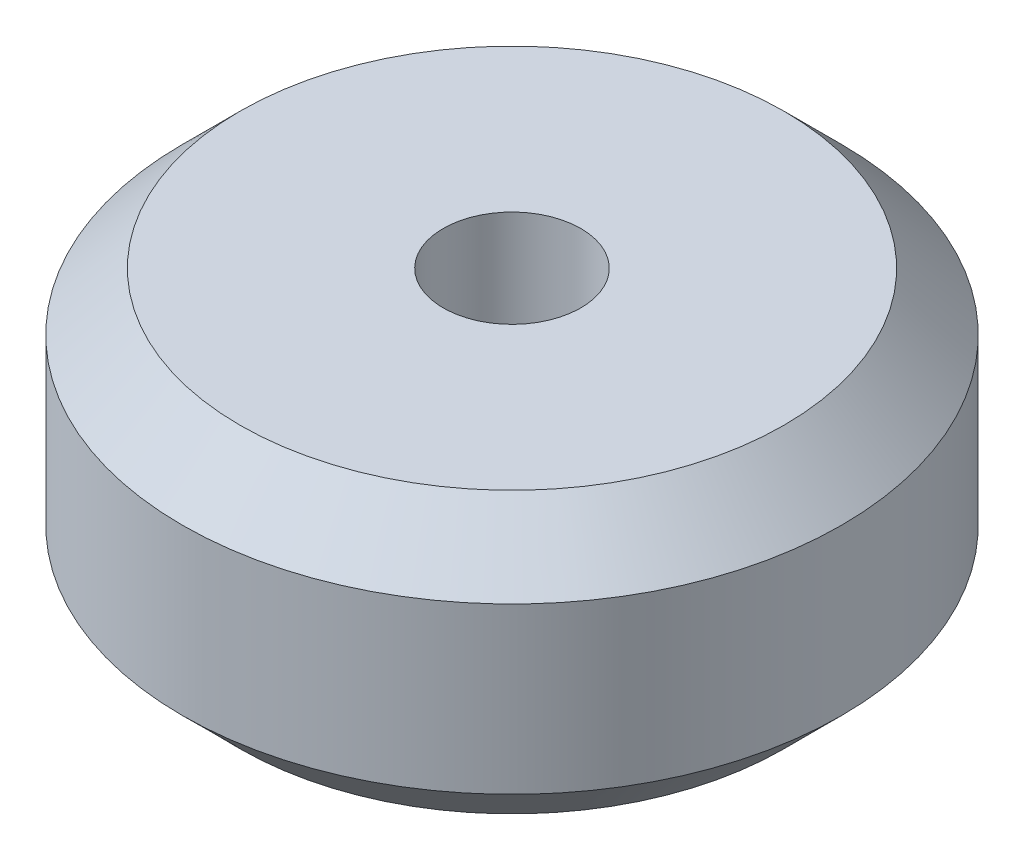
ISO-10303-21;
HEADER;
FILE_DESCRIPTION(('STEP AP214'),'2;1');
FILE_NAME('part.step','',(''),(''),'','','');
FILE_SCHEMA(('AUTOMOTIVE_DESIGN { 1 0 10303 214 1 1 1 1 }'));
ENDSEC;
DATA;
#1=APPLICATION_CONTEXT('core data for automotive mechanical design processes');
#2=APPLICATION_PROTOCOL_DEFINITION('international standard','automotive_design',2000,#1);
#3=PRODUCT_CONTEXT('',#1,'mechanical');
#4=PRODUCT('Part','Part','',(#3));
#5=PRODUCT_RELATED_PRODUCT_CATEGORY('part','',(#4));
#6=PRODUCT_DEFINITION_FORMATION('','',#4);
#7=PRODUCT_DEFINITION_CONTEXT('part definition',#1,'design');
#8=PRODUCT_DEFINITION('design','',#6,#7);
#9=PRODUCT_DEFINITION_SHAPE('','',#8);
#10=(LENGTH_UNIT() NAMED_UNIT(*) SI_UNIT(.MILLI.,.METRE.));
#11=(NAMED_UNIT(*) PLANE_ANGLE_UNIT() SI_UNIT($,.RADIAN.));
#12=(NAMED_UNIT(*) SI_UNIT($,.STERADIAN.) SOLID_ANGLE_UNIT());
#13=UNCERTAINTY_MEASURE_WITH_UNIT(LENGTH_MEASURE(1.E-05),#10,'distance_accuracy_value','');
#14=(GEOMETRIC_REPRESENTATION_CONTEXT(3) GLOBAL_UNCERTAINTY_ASSIGNED_CONTEXT((#13)) GLOBAL_UNIT_ASSIGNED_CONTEXT((#10,
#11,#12)) REPRESENTATION_CONTEXT('',''));
#15=CARTESIAN_POINT('',(0.,0.,0.));
#16=DIRECTION('',(0.,0.,1.));
#17=DIRECTION('',(1.,0.,0.));
#18=AXIS2_PLACEMENT_3D('',#15,#16,#17);
#19=CARTESIAN_POINT('',(9.9,-5.1,0.));
#20=DIRECTION('',(0.,-1.,0.));
#21=DIRECTION('',(0.,0.,-1.));
#22=AXIS2_PLACEMENT_3D('',#19,#20,#21);
#23=PLANE('',#22);
#24=CARTESIAN_POINT('',(0.,-5.1,0.));
#25=DIRECTION('',(0.,-1.,0.));
#26=DIRECTION('',(0.,0.,-1.));
#27=AXIS2_PLACEMENT_3D('',#24,#25,#26);
#28=CIRCLE('',#27,9.9);
#29=CARTESIAN_POINT('',(0.,-5.1,-9.9));
#30=VERTEX_POINT('',#29);
#31=EDGE_CURVE('E56',#30,#30,#28,.T.);
#32=ORIENTED_EDGE('',*,*,#31,.T.);
#33=EDGE_LOOP('',(#32));
#34=FACE_BOUND('',#33,.T.);
#35=CARTESIAN_POINT('',(0.,-5.1,0.));
#36=DIRECTION('',(0.,-1.,0.));
#37=DIRECTION('',(0.,0.,-1.));
#38=AXIS2_PLACEMENT_3D('',#35,#36,#37);
#39=CIRCLE('',#38,2.505);
#40=CARTESIAN_POINT('',(0.,-5.1,-2.505));
#41=VERTEX_POINT('',#40);
#42=EDGE_CURVE('E10',#41,#41,#39,.T.);
#43=ORIENTED_EDGE('',*,*,#42,.F.);
#44=EDGE_LOOP('',(#43));
#45=FACE_BOUND('',#44,.T.);
#46=ADVANCED_FACE('F34',(#34,#45),#23,.T.);
#47=CARTESIAN_POINT('',(0.,0.,0.));
#48=DIRECTION('',(0.,-1.,0.));
#49=DIRECTION('',(0.,0.,-1.));
#50=AXIS2_PLACEMENT_3D('',#47,#48,#49);
#51=CYLINDRICAL_SURFACE('',#50,2.505);
#52=ORIENTED_EDGE('',*,*,#42,.T.);
#53=EDGE_LOOP('',(#52));
#54=FACE_BOUND('',#53,.T.);
#55=CARTESIAN_POINT('',(0.,5.1,0.));
#56=DIRECTION('',(0.,-1.,0.));
#57=DIRECTION('',(0.,0.,-1.));
#58=AXIS2_PLACEMENT_3D('',#55,#56,#57);
#59=CIRCLE('',#58,2.505);
#60=CARTESIAN_POINT('',(0.,5.1,-2.505));
#61=VERTEX_POINT('',#60);
#62=EDGE_CURVE('E40',#61,#61,#59,.T.);
#63=ORIENTED_EDGE('',*,*,#62,.F.);
#64=EDGE_LOOP('',(#63));
#65=FACE_BOUND('',#64,.T.);
#66=ADVANCED_FACE('F74',(#54,#65),#51,.F.);
#67=CARTESIAN_POINT('',(2.505,5.1,0.));
#68=DIRECTION('',(0.,1.,0.));
#69=DIRECTION('',(0.,0.,1.));
#70=AXIS2_PLACEMENT_3D('',#67,#68,#69);
#71=PLANE('',#70);
#72=ORIENTED_EDGE('',*,*,#62,.T.);
#73=EDGE_LOOP('',(#72));
#74=FACE_BOUND('',#73,.T.);
#75=CARTESIAN_POINT('',(0.,5.1,0.));
#76=DIRECTION('',(0.,-1.,0.));
#77=DIRECTION('',(0.,0.,-1.));
#78=AXIS2_PLACEMENT_3D('',#75,#76,#77);
#79=CIRCLE('',#78,9.9);
#80=CARTESIAN_POINT('',(0.,5.1,-9.9));
#81=VERTEX_POINT('',#80);
#82=EDGE_CURVE('E44',#81,#81,#79,.T.);
#83=ORIENTED_EDGE('',*,*,#82,.F.);
#84=EDGE_LOOP('',(#83));
#85=FACE_BOUND('',#84,.T.);
#86=ADVANCED_FACE('F78',(#74,#85),#71,.T.);
#87=CARTESIAN_POINT('',(0.,3.,0.));
#88=DIRECTION('',(0.,-1.,0.));
#89=DIRECTION('',(0.,0.,-1.));
#90=AXIS2_PLACEMENT_3D('',#87,#88,#89);
#91=CONICAL_SURFACE('',#90,12.,0.785398163397449);
#92=ORIENTED_EDGE('',*,*,#82,.T.);
#93=EDGE_LOOP('',(#92));
#94=FACE_BOUND('',#93,.T.);
#95=CARTESIAN_POINT('',(0.,3.,0.));
#96=DIRECTION('',(0.,-1.,0.));
#97=DIRECTION('',(0.,0.,-1.));
#98=AXIS2_PLACEMENT_3D('',#95,#96,#97);
#99=CIRCLE('',#98,12.);
#100=CARTESIAN_POINT('',(0.,3.,-12.));
#101=VERTEX_POINT('',#100);
#102=EDGE_CURVE('E48',#101,#101,#99,.T.);
#103=ORIENTED_EDGE('',*,*,#102,.F.);
#104=EDGE_LOOP('',(#103));
#105=FACE_BOUND('',#104,.T.);
#106=ADVANCED_FACE('F70',(#94,#105),#91,.T.);
#107=CARTESIAN_POINT('',(0.,0.,0.));
#108=DIRECTION('',(0.,-1.,0.));
#109=DIRECTION('',(0.,0.,-1.));
#110=AXIS2_PLACEMENT_3D('',#107,#108,#109);
#111=CYLINDRICAL_SURFACE('',#110,12.);
#112=ORIENTED_EDGE('',*,*,#102,.T.);
#113=EDGE_LOOP('',(#112));
#114=FACE_BOUND('',#113,.T.);
#115=CARTESIAN_POINT('',(0.,-3.,0.));
#116=DIRECTION('',(0.,-1.,0.));
#117=DIRECTION('',(0.,0.,-1.));
#118=AXIS2_PLACEMENT_3D('',#115,#116,#117);
#119=CIRCLE('',#118,12.);
#120=CARTESIAN_POINT('',(0.,-3.,-12.));
#121=VERTEX_POINT('',#120);
#122=EDGE_CURVE('E53',#121,#121,#119,.T.);
#123=ORIENTED_EDGE('',*,*,#122,.F.);
#124=EDGE_LOOP('',(#123));
#125=FACE_BOUND('',#124,.T.);
#126=ADVANCED_FACE('F64',(#114,#125),#111,.T.);
#127=CARTESIAN_POINT('',(0.,-5.1,0.));
#128=DIRECTION('',(0.,1.,0.));
#129=DIRECTION('',(0.,0.,1.));
#130=AXIS2_PLACEMENT_3D('',#127,#128,#129);
#131=CONICAL_SURFACE('',#130,9.9,0.785398163397449);
#132=ORIENTED_EDGE('',*,*,#122,.T.);
#133=EDGE_LOOP('',(#132));
#134=FACE_BOUND('',#133,.T.);
#135=ORIENTED_EDGE('',*,*,#31,.F.);
#136=EDGE_LOOP('',(#135));
#137=FACE_BOUND('',#136,.T.);
#138=ADVANCED_FACE('F62',(#134,#137),#131,.T.);
#139=CLOSED_SHELL('',(#46,#66,#86,#106,#126,#138));
#140=MANIFOLD_SOLID_BREP('B2',#139);
#141=ADVANCED_BREP_SHAPE_REPRESENTATION('',(#18,#140),#14);
#142=SHAPE_DEFINITION_REPRESENTATION(#9,#141);
ENDSEC;
END-ISO-10303-21;
